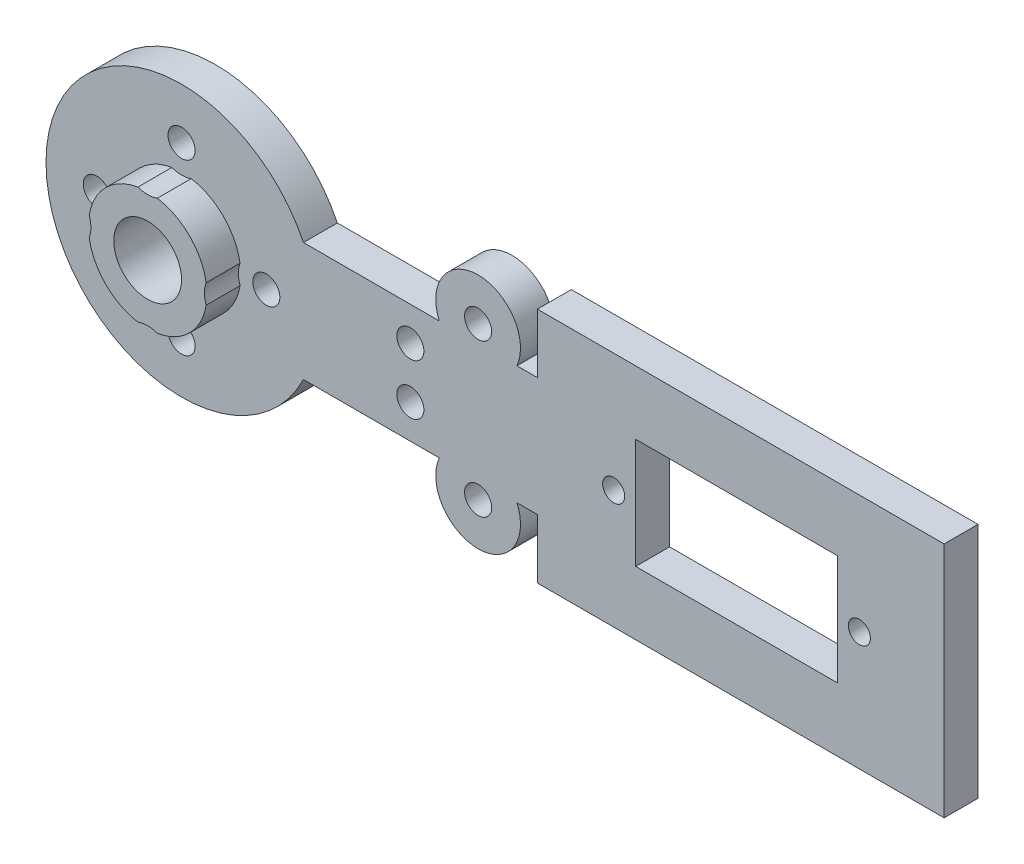
ISO-10303-21;
HEADER;
FILE_DESCRIPTION(('STEP AP214'),'2;1');
FILE_NAME('part.step','',(''),(''),'','','');
FILE_SCHEMA(('AUTOMOTIVE_DESIGN { 1 0 10303 214 1 1 1 1 }'));
ENDSEC;
DATA;
#1=APPLICATION_CONTEXT('core data for automotive mechanical design processes');
#2=APPLICATION_PROTOCOL_DEFINITION('international standard','automotive_design',2000,#1);
#3=PRODUCT_CONTEXT('',#1,'mechanical');
#4=PRODUCT('Part','Part','',(#3));
#5=PRODUCT_RELATED_PRODUCT_CATEGORY('part','',(#4));
#6=PRODUCT_DEFINITION_FORMATION('','',#4);
#7=PRODUCT_DEFINITION_CONTEXT('part definition',#1,'design');
#8=PRODUCT_DEFINITION('design','',#6,#7);
#9=PRODUCT_DEFINITION_SHAPE('','',#8);
#10=(LENGTH_UNIT() NAMED_UNIT(*) SI_UNIT(.MILLI.,.METRE.));
#11=(NAMED_UNIT(*) PLANE_ANGLE_UNIT() SI_UNIT($,.RADIAN.));
#12=(NAMED_UNIT(*) SI_UNIT($,.STERADIAN.) SOLID_ANGLE_UNIT());
#13=UNCERTAINTY_MEASURE_WITH_UNIT(LENGTH_MEASURE(1.E-05),#10,'distance_accuracy_value','');
#14=(GEOMETRIC_REPRESENTATION_CONTEXT(3) GLOBAL_UNCERTAINTY_ASSIGNED_CONTEXT((#13)) GLOBAL_UNIT_ASSIGNED_CONTEXT((#10,
#11,#12)) REPRESENTATION_CONTEXT('',''));
#15=CARTESIAN_POINT('',(0.,0.,0.));
#16=DIRECTION('',(0.,0.,1.));
#17=DIRECTION('',(1.,0.,0.));
#18=AXIS2_PLACEMENT_3D('',#15,#16,#17);
#19=CARTESIAN_POINT('',(0.,0.,8.));
#20=DIRECTION('',(0.,0.,1.));
#21=DIRECTION('',(1.,0.,0.));
#22=AXIS2_PLACEMENT_3D('',#19,#20,#21);
#23=PLANE('',#22);
#24=CARTESIAN_POINT('',(0.,0.,8.));
#25=DIRECTION('',(0.,0.,1.));
#26=DIRECTION('',(1.,0.,0.));
#27=AXIS2_PLACEMENT_3D('',#24,#25,#26);
#28=CIRCLE('',#27,4.);
#29=CARTESIAN_POINT('',(4.,0.,8.));
#30=VERTEX_POINT('',#29);
#31=EDGE_CURVE('E517',#30,#30,#28,.T.);
#32=ORIENTED_EDGE('',*,*,#31,.F.);
#33=EDGE_LOOP('',(#32));
#34=FACE_BOUND('',#33,.T.);
#35=CARTESIAN_POINT('',(10.,0.,8.));
#36=DIRECTION('',(0.,0.,1.));
#37=DIRECTION('',(1.,0.,0.));
#38=AXIS2_PLACEMENT_3D('',#35,#36,#37);
#39=CIRCLE('',#38,3.3);
#40=CARTESIAN_POINT('',(6.9055,1.14632881408433,8.));
#41=VERTEX_POINT('',#40);
#42=CARTESIAN_POINT('',(6.9055,-1.14632881408433,8.));
#43=VERTEX_POINT('',#42);
#44=EDGE_CURVE('E508',#41,#43,#39,.T.);
#45=ORIENTED_EDGE('',*,*,#44,.F.);
#46=CARTESIAN_POINT('',(0.,0.,8.));
#47=DIRECTION('',(0.,0.,1.));
#48=DIRECTION('',(1.,0.,0.));
#49=AXIS2_PLACEMENT_3D('',#46,#47,#48);
#50=CIRCLE('',#49,7.);
#51=CARTESIAN_POINT('',(1.14632881408434,6.9055,8.));
#52=VERTEX_POINT('',#51);
#53=EDGE_CURVE('E242',#41,#52,#50,.T.);
#54=ORIENTED_EDGE('',*,*,#53,.T.);
#55=CARTESIAN_POINT('',(0.,10.,8.));
#56=DIRECTION('',(0.,0.,1.));
#57=DIRECTION('',(1.,0.,0.));
#58=AXIS2_PLACEMENT_3D('',#55,#56,#57);
#59=CIRCLE('',#58,3.3);
#60=CARTESIAN_POINT('',(-1.14632881408434,6.9055,8.));
#61=VERTEX_POINT('',#60);
#62=EDGE_CURVE('E229',#61,#52,#59,.T.);
#63=ORIENTED_EDGE('',*,*,#62,.F.);
#64=CARTESIAN_POINT('',(-6.9055,1.14632881408434,8.));
#65=VERTEX_POINT('',#64);
#66=EDGE_CURVE('E521',#61,#65,#50,.T.);
#67=ORIENTED_EDGE('',*,*,#66,.T.);
#68=CARTESIAN_POINT('',(-10.,0.,8.));
#69=DIRECTION('',(0.,0.,1.));
#70=DIRECTION('',(1.,0.,0.));
#71=AXIS2_PLACEMENT_3D('',#68,#69,#70);
#72=CIRCLE('',#71,3.3);
#73=CARTESIAN_POINT('',(-6.9055,-1.14632881408434,8.));
#74=VERTEX_POINT('',#73);
#75=EDGE_CURVE('E545',#74,#65,#72,.T.);
#76=ORIENTED_EDGE('',*,*,#75,.F.);
#77=CARTESIAN_POINT('',(-1.14632881408434,-6.9055,8.));
#78=VERTEX_POINT('',#77);
#79=EDGE_CURVE('E528',#74,#78,#50,.T.);
#80=ORIENTED_EDGE('',*,*,#79,.T.);
#81=CARTESIAN_POINT('',(0.,-10.,8.));
#82=DIRECTION('',(0.,0.,1.));
#83=DIRECTION('',(1.,0.,0.));
#84=AXIS2_PLACEMENT_3D('',#81,#82,#83);
#85=CIRCLE('',#84,3.3);
#86=CARTESIAN_POINT('',(1.14632881408434,-6.9055,8.));
#87=VERTEX_POINT('',#86);
#88=EDGE_CURVE('E210',#87,#78,#85,.T.);
#89=ORIENTED_EDGE('',*,*,#88,.F.);
#90=EDGE_CURVE('E518',#87,#43,#50,.T.);
#91=ORIENTED_EDGE('',*,*,#90,.T.);
#92=EDGE_LOOP('',(#45,#54,#63,#67,#76,#80,#89,#91));
#93=FACE_BOUND('',#92,.T.);
#94=ADVANCED_FACE('F44',(#34,#93),#23,.T.);
#95=CARTESIAN_POINT('',(0.,0.,8.));
#96=DIRECTION('',(0.,0.,-1.));
#97=DIRECTION('',(-1.,0.,0.));
#98=AXIS2_PLACEMENT_3D('',#95,#96,#97);
#99=CYLINDRICAL_SURFACE('',#98,7.);
#100=DIRECTION('',(0.,0.,-1.));
#101=VECTOR('',#100,1.);
#102=CARTESIAN_POINT('',(6.9055,-1.14632881408434,6.));
#103=LINE('',#102,#101);
#104=CARTESIAN_POINT('',(6.9055,-1.14632881408433,4.));
#105=VERTEX_POINT('',#104);
#106=EDGE_CURVE('E11',#43,#105,#103,.T.);
#107=ORIENTED_EDGE('',*,*,#106,.F.);
#108=ORIENTED_EDGE('',*,*,#90,.F.);
#109=DIRECTION('',(0.,0.,-1.));
#110=VECTOR('',#109,1.);
#111=CARTESIAN_POINT('',(1.14632881408434,-6.9055,6.));
#112=LINE('',#111,#110);
#113=CARTESIAN_POINT('',(1.14632881408434,-6.9055,4.));
#114=VERTEX_POINT('',#113);
#115=EDGE_CURVE('E212',#114,#87,#112,.F.);
#116=ORIENTED_EDGE('',*,*,#115,.F.);
#117=CARTESIAN_POINT('',(0.,0.,4.));
#118=DIRECTION('',(0.,0.,1.));
#119=DIRECTION('',(1.,0.,0.));
#120=AXIS2_PLACEMENT_3D('',#117,#118,#119);
#121=CIRCLE('',#120,7.);
#122=EDGE_CURVE('E223',#114,#105,#121,.T.);
#123=ORIENTED_EDGE('',*,*,#122,.T.);
#124=EDGE_LOOP('',(#107,#108,#116,#123));
#125=FACE_BOUND('',#124,.T.);
#126=ADVANCED_FACE('F548',(#125),#99,.T.);
#127=DIRECTION('',(0.,0.,-1.));
#128=VECTOR('',#127,1.);
#129=CARTESIAN_POINT('',(6.9055,1.14632881408434,6.));
#130=LINE('',#129,#128);
#131=CARTESIAN_POINT('',(6.9055,1.14632881408433,4.));
#132=VERTEX_POINT('',#131);
#133=EDGE_CURVE('E53',#132,#41,#130,.F.);
#134=ORIENTED_EDGE('',*,*,#133,.F.);
#135=CARTESIAN_POINT('',(1.14632881408434,6.9055,4.));
#136=VERTEX_POINT('',#135);
#137=EDGE_CURVE('E240',#132,#136,#121,.T.);
#138=ORIENTED_EDGE('',*,*,#137,.T.);
#139=DIRECTION('',(0.,0.,-1.));
#140=VECTOR('',#139,1.);
#141=CARTESIAN_POINT('',(1.14632881408434,6.9055,6.));
#142=LINE('',#141,#140);
#143=EDGE_CURVE('E493',#52,#136,#142,.T.);
#144=ORIENTED_EDGE('',*,*,#143,.F.);
#145=ORIENTED_EDGE('',*,*,#53,.F.);
#146=EDGE_LOOP('',(#134,#138,#144,#145));
#147=FACE_BOUND('',#146,.T.);
#148=ADVANCED_FACE('F523',(#147),#99,.T.);
#149=DIRECTION('',(0.,0.,-1.));
#150=VECTOR('',#149,1.);
#151=CARTESIAN_POINT('',(-6.9055,1.14632881408434,6.));
#152=LINE('',#151,#150);
#153=CARTESIAN_POINT('',(-6.9055,1.14632881408434,4.));
#154=VERTEX_POINT('',#153);
#155=EDGE_CURVE('E496',#65,#154,#152,.T.);
#156=ORIENTED_EDGE('',*,*,#155,.F.);
#157=ORIENTED_EDGE('',*,*,#66,.F.);
#158=DIRECTION('',(0.,0.,-1.));
#159=VECTOR('',#158,1.);
#160=CARTESIAN_POINT('',(-1.14632881408434,6.9055,6.));
#161=LINE('',#160,#159);
#162=CARTESIAN_POINT('',(-1.14632881408434,6.9055,4.));
#163=VERTEX_POINT('',#162);
#164=EDGE_CURVE('E213',#163,#61,#161,.F.);
#165=ORIENTED_EDGE('',*,*,#164,.F.);
#166=EDGE_CURVE('E235',#163,#154,#121,.T.);
#167=ORIENTED_EDGE('',*,*,#166,.T.);
#168=EDGE_LOOP('',(#156,#157,#165,#167));
#169=FACE_BOUND('',#168,.T.);
#170=ADVANCED_FACE('F553',(#169),#99,.T.);
#171=DIRECTION('',(0.,0.,-1.));
#172=VECTOR('',#171,1.);
#173=CARTESIAN_POINT('',(-6.9055,-1.14632881408434,6.));
#174=LINE('',#173,#172);
#175=CARTESIAN_POINT('',(-6.9055,-1.14632881408434,4.));
#176=VERTEX_POINT('',#175);
#177=EDGE_CURVE('E226',#176,#74,#174,.F.);
#178=ORIENTED_EDGE('',*,*,#177,.F.);
#179=CARTESIAN_POINT('',(-1.14632881408434,-6.9055,4.));
#180=VERTEX_POINT('',#179);
#181=EDGE_CURVE('E225',#176,#180,#121,.T.);
#182=ORIENTED_EDGE('',*,*,#181,.T.);
#183=DIRECTION('',(0.,0.,-1.));
#184=VECTOR('',#183,1.);
#185=CARTESIAN_POINT('',(-1.14632881408434,-6.9055,6.));
#186=LINE('',#185,#184);
#187=EDGE_CURVE('E204',#78,#180,#186,.T.);
#188=ORIENTED_EDGE('',*,*,#187,.F.);
#189=ORIENTED_EDGE('',*,*,#79,.F.);
#190=EDGE_LOOP('',(#178,#182,#188,#189));
#191=FACE_BOUND('',#190,.T.);
#192=ADVANCED_FACE('F230',(#191),#99,.T.);
#193=CARTESIAN_POINT('',(0.,7.,4.));
#194=DIRECTION('',(0.,-1.,0.));
#195=DIRECTION('',(0.,0.,-1.));
#196=AXIS2_PLACEMENT_3D('',#193,#194,#195);
#197=PLANE('',#196);
#198=DIRECTION('',(0.,0.,-1.));
#199=VECTOR('',#198,1.);
#200=CARTESIAN_POINT('',(30.4174243050442,7.,4.));
#201=LINE('',#200,#199);
#202=CARTESIAN_POINT('',(30.4174243050442,7.,0.));
#203=VERTEX_POINT('',#202);
#204=CARTESIAN_POINT('',(30.4174243050442,7.,4.));
#205=VERTEX_POINT('',#204);
#206=EDGE_CURVE('E236',#203,#205,#201,.F.);
#207=ORIENTED_EDGE('',*,*,#206,.F.);
#208=DIRECTION('',(-1.,0.,0.));
#209=VECTOR('',#208,1.);
#210=CARTESIAN_POINT('',(0.,7.,0.));
#211=LINE('',#210,#209);
#212=CARTESIAN_POINT('',(14.3874945699382,7.,0.));
#213=VERTEX_POINT('',#212);
#214=EDGE_CURVE('E419',#203,#213,#211,.T.);
#215=ORIENTED_EDGE('',*,*,#214,.T.);
#216=DIRECTION('',(0.,0.,-1.));
#217=VECTOR('',#216,1.);
#218=CARTESIAN_POINT('',(14.3874945699382,7.,4.));
#219=LINE('',#218,#217);
#220=CARTESIAN_POINT('',(14.3874945699382,7.,4.));
#221=VERTEX_POINT('',#220);
#222=EDGE_CURVE('E395',#221,#213,#219,.T.);
#223=ORIENTED_EDGE('',*,*,#222,.F.);
#224=DIRECTION('',(-1.,0.,0.));
#225=VECTOR('',#224,1.);
#226=CARTESIAN_POINT('',(0.,7.,4.));
#227=LINE('',#226,#225);
#228=EDGE_CURVE('E406',#205,#221,#227,.T.);
#229=ORIENTED_EDGE('',*,*,#228,.F.);
#230=EDGE_LOOP('',(#207,#215,#223,#229));
#231=FACE_BOUND('',#230,.T.);
#232=ADVANCED_FACE('F673',(#231),#197,.F.);
#233=DIRECTION('',(0.,0.,-1.));
#234=VECTOR('',#233,1.);
#235=CARTESIAN_POINT('',(39.5825756949558,7.,4.));
#236=LINE('',#235,#234);
#237=CARTESIAN_POINT('',(39.5825756949558,7.,4.));
#238=VERTEX_POINT('',#237);
#239=CARTESIAN_POINT('',(39.5825756949558,7.,0.));
#240=VERTEX_POINT('',#239);
#241=EDGE_CURVE('E480',#238,#240,#236,.T.);
#242=ORIENTED_EDGE('',*,*,#241,.F.);
#243=CARTESIAN_POINT('',(42.,7.,4.));
#244=VERTEX_POINT('',#243);
#245=EDGE_CURVE('E415',#244,#238,#227,.T.);
#246=ORIENTED_EDGE('',*,*,#245,.F.);
#247=DIRECTION('',(0.,0.,1.));
#248=VECTOR('',#247,1.);
#249=CARTESIAN_POINT('',(42.,7.,4.));
#250=LINE('',#249,#248);
#251=CARTESIAN_POINT('',(42.,7.,0.));
#252=VERTEX_POINT('',#251);
#253=EDGE_CURVE('E381',#252,#244,#250,.T.);
#254=ORIENTED_EDGE('',*,*,#253,.F.);
#255=EDGE_CURVE('E423',#252,#240,#211,.T.);
#256=ORIENTED_EDGE('',*,*,#255,.T.);
#257=EDGE_LOOP('',(#242,#246,#254,#256));
#258=FACE_BOUND('',#257,.T.);
#259=ADVANCED_FACE('F671',(#258),#197,.F.);
#260=CARTESIAN_POINT('',(0.,-7.,4.));
#261=DIRECTION('',(0.,1.,0.));
#262=DIRECTION('',(0.,0.,1.));
#263=AXIS2_PLACEMENT_3D('',#260,#261,#262);
#264=PLANE('',#263);
#265=DIRECTION('',(0.,0.,-1.));
#266=VECTOR('',#265,1.);
#267=CARTESIAN_POINT('',(39.5825756949558,-7.,4.));
#268=LINE('',#267,#266);
#269=CARTESIAN_POINT('',(39.5825756949558,-7.,0.));
#270=VERTEX_POINT('',#269);
#271=CARTESIAN_POINT('',(39.5825756949558,-7.,4.));
#272=VERTEX_POINT('',#271);
#273=EDGE_CURVE('E471',#270,#272,#268,.F.);
#274=ORIENTED_EDGE('',*,*,#273,.F.);
#275=DIRECTION('',(1.,0.,0.));
#276=VECTOR('',#275,1.);
#277=CARTESIAN_POINT('',(0.,-7.,0.));
#278=LINE('',#277,#276);
#279=CARTESIAN_POINT('',(42.,-7.,0.));
#280=VERTEX_POINT('',#279);
#281=EDGE_CURVE('E403',#270,#280,#278,.T.);
#282=ORIENTED_EDGE('',*,*,#281,.T.);
#283=DIRECTION('',(0.,0.,-1.));
#284=VECTOR('',#283,1.);
#285=CARTESIAN_POINT('',(42.,-7.,4.));
#286=LINE('',#285,#284);
#287=CARTESIAN_POINT('',(42.,-7.,4.));
#288=VERTEX_POINT('',#287);
#289=EDGE_CURVE('E384',#288,#280,#286,.T.);
#290=ORIENTED_EDGE('',*,*,#289,.F.);
#291=DIRECTION('',(1.,0.,0.));
#292=VECTOR('',#291,1.);
#293=CARTESIAN_POINT('',(0.,-7.,4.));
#294=LINE('',#293,#292);
#295=EDGE_CURVE('E413',#272,#288,#294,.T.);
#296=ORIENTED_EDGE('',*,*,#295,.F.);
#297=EDGE_LOOP('',(#274,#282,#290,#296));
#298=FACE_BOUND('',#297,.T.);
#299=ADVANCED_FACE('F50',(#298),#264,.F.);
#300=DIRECTION('',(0.,0.,-1.));
#301=VECTOR('',#300,1.);
#302=CARTESIAN_POINT('',(30.4174243050442,-7.,4.));
#303=LINE('',#302,#301);
#304=CARTESIAN_POINT('',(30.4174243050442,-7.,4.));
#305=VERTEX_POINT('',#304);
#306=CARTESIAN_POINT('',(30.4174243050442,-7.,0.));
#307=VERTEX_POINT('',#306);
#308=EDGE_CURVE('E438',#305,#307,#303,.T.);
#309=ORIENTED_EDGE('',*,*,#308,.F.);
#310=CARTESIAN_POINT('',(14.3874945699382,-7.,4.));
#311=VERTEX_POINT('',#310);
#312=EDGE_CURVE('E408',#311,#305,#294,.T.);
#313=ORIENTED_EDGE('',*,*,#312,.F.);
#314=DIRECTION('',(0.,0.,-1.));
#315=VECTOR('',#314,1.);
#316=CARTESIAN_POINT('',(14.3874945699382,-7.,4.));
#317=LINE('',#316,#315);
#318=CARTESIAN_POINT('',(14.3874945699382,-7.,0.));
#319=VERTEX_POINT('',#318);
#320=EDGE_CURVE('E402',#319,#311,#317,.F.);
#321=ORIENTED_EDGE('',*,*,#320,.F.);
#322=EDGE_CURVE('E417',#319,#307,#278,.T.);
#323=ORIENTED_EDGE('',*,*,#322,.T.);
#324=EDGE_LOOP('',(#309,#313,#321,#323));
#325=FACE_BOUND('',#324,.T.);
#326=ADVANCED_FACE('F667',(#325),#264,.F.);
#327=CARTESIAN_POINT('',(0.,0.,4.));
#328=DIRECTION('',(0.,0.,-1.));
#329=DIRECTION('',(-1.,0.,0.));
#330=AXIS2_PLACEMENT_3D('',#327,#328,#329);
#331=PLANE('',#330);
#332=ORIENTED_EDGE('',*,*,#137,.F.);
#333=CARTESIAN_POINT('',(10.,0.,4.));
#334=DIRECTION('',(0.,0.,1.));
#335=DIRECTION('',(1.,0.,0.));
#336=AXIS2_PLACEMENT_3D('',#333,#334,#335);
#337=CIRCLE('',#336,3.3);
#338=EDGE_CURVE('E506',#132,#105,#337,.T.);
#339=ORIENTED_EDGE('',*,*,#338,.T.);
#340=ORIENTED_EDGE('',*,*,#122,.F.);
#341=CARTESIAN_POINT('',(0.,-10.,4.));
#342=DIRECTION('',(0.,0.,1.));
#343=DIRECTION('',(1.,0.,0.));
#344=AXIS2_PLACEMENT_3D('',#341,#342,#343);
#345=CIRCLE('',#344,3.3);
#346=EDGE_CURVE('E63',#114,#180,#345,.T.);
#347=ORIENTED_EDGE('',*,*,#346,.T.);
#348=ORIENTED_EDGE('',*,*,#181,.F.);
#349=CARTESIAN_POINT('',(-10.,0.,4.));
#350=DIRECTION('',(0.,0.,1.));
#351=DIRECTION('',(1.,0.,0.));
#352=AXIS2_PLACEMENT_3D('',#349,#350,#351);
#353=CIRCLE('',#352,3.3);
#354=EDGE_CURVE('E69',#176,#154,#353,.T.);
#355=ORIENTED_EDGE('',*,*,#354,.T.);
#356=ORIENTED_EDGE('',*,*,#166,.F.);
#357=CARTESIAN_POINT('',(0.,10.,4.));
#358=DIRECTION('',(0.,0.,1.));
#359=DIRECTION('',(1.,0.,0.));
#360=AXIS2_PLACEMENT_3D('',#357,#358,#359);
#361=CIRCLE('',#360,3.3);
#362=EDGE_CURVE('E538',#163,#136,#361,.T.);
#363=ORIENTED_EDGE('',*,*,#362,.T.);
#364=EDGE_LOOP('',(#332,#339,#340,#347,#348,#355,#356,#363));
#365=FACE_BOUND('',#364,.T.);
#366=CARTESIAN_POINT('',(35.,-9.,4.));
#367=DIRECTION('',(0.,0.,1.));
#368=DIRECTION('',(1.,0.,0.));
#369=AXIS2_PLACEMENT_3D('',#366,#367,#368);
#370=CIRCLE('',#369,1.6);
#371=CARTESIAN_POINT('',(36.6,-9.,4.));
#372=VERTEX_POINT('',#371);
#373=EDGE_CURVE('E241',#372,#372,#370,.T.);
#374=ORIENTED_EDGE('',*,*,#373,.F.);
#375=EDGE_LOOP('',(#374));
#376=FACE_BOUND('',#375,.T.);
#377=CARTESIAN_POINT('',(35.,9.,4.));
#378=DIRECTION('',(0.,0.,1.));
#379=DIRECTION('',(1.,0.,0.));
#380=AXIS2_PLACEMENT_3D('',#377,#378,#379);
#381=CIRCLE('',#380,1.6);
#382=CARTESIAN_POINT('',(36.6,9.,4.));
#383=VERTEX_POINT('',#382);
#384=EDGE_CURVE('E247',#383,#383,#381,.T.);
#385=ORIENTED_EDGE('',*,*,#384,.F.);
#386=EDGE_LOOP('',(#385));
#387=FACE_BOUND('',#386,.T.);
#388=ORIENTED_EDGE('',*,*,#245,.T.);
#389=CARTESIAN_POINT('',(35.,9.,4.));
#390=DIRECTION('',(0.,0.,1.));
#391=DIRECTION('',(1.,0.,0.));
#392=AXIS2_PLACEMENT_3D('',#389,#390,#391);
#393=CIRCLE('',#392,5.);
#394=EDGE_CURVE('E255',#238,#205,#393,.T.);
#395=ORIENTED_EDGE('',*,*,#394,.T.);
#396=ORIENTED_EDGE('',*,*,#228,.T.);
#397=CARTESIAN_POINT('',(0.,0.,4.));
#398=DIRECTION('',(0.,0.,1.));
#399=DIRECTION('',(1.,0.,0.));
#400=AXIS2_PLACEMENT_3D('',#397,#398,#399);
#401=CIRCLE('',#400,16.);
#402=EDGE_CURVE('E388',#221,#311,#401,.T.);
#403=ORIENTED_EDGE('',*,*,#402,.T.);
#404=ORIENTED_EDGE('',*,*,#312,.T.);
#405=CARTESIAN_POINT('',(35.,-9.,4.));
#406=DIRECTION('',(0.,0.,1.));
#407=DIRECTION('',(1.,0.,0.));
#408=AXIS2_PLACEMENT_3D('',#405,#406,#407);
#409=CIRCLE('',#408,5.);
#410=EDGE_CURVE('E262',#305,#272,#409,.T.);
#411=ORIENTED_EDGE('',*,*,#410,.T.);
#412=ORIENTED_EDGE('',*,*,#295,.T.);
#413=DIRECTION('',(0.,-1.,0.));
#414=VECTOR('',#413,1.);
#415=CARTESIAN_POINT('',(42.,-14.,4.));
#416=LINE('',#415,#414);
#417=CARTESIAN_POINT('',(42.,-14.,4.));
#418=VERTEX_POINT('',#417);
#419=EDGE_CURVE('E341',#288,#418,#416,.T.);
#420=ORIENTED_EDGE('',*,*,#419,.T.);
#421=DIRECTION('',(1.,0.,0.));
#422=VECTOR('',#421,1.);
#423=CARTESIAN_POINT('',(42.,-14.,4.));
#424=LINE('',#423,#422);
#425=CARTESIAN_POINT('',(90.,-14.,4.));
#426=VERTEX_POINT('',#425);
#427=EDGE_CURVE('E345',#418,#426,#424,.T.);
#428=ORIENTED_EDGE('',*,*,#427,.T.);
#429=DIRECTION('',(0.,1.,0.));
#430=VECTOR('',#429,1.);
#431=CARTESIAN_POINT('',(90.,-14.,4.));
#432=LINE('',#431,#430);
#433=CARTESIAN_POINT('',(90.,14.,4.));
#434=VERTEX_POINT('',#433);
#435=EDGE_CURVE('E347',#426,#434,#432,.T.);
#436=ORIENTED_EDGE('',*,*,#435,.T.);
#437=DIRECTION('',(-1.,0.,0.));
#438=VECTOR('',#437,1.);
#439=CARTESIAN_POINT('',(42.,14.,4.));
#440=LINE('',#439,#438);
#441=CARTESIAN_POINT('',(42.,14.,4.));
#442=VERTEX_POINT('',#441);
#443=EDGE_CURVE('E349',#434,#442,#440,.T.);
#444=ORIENTED_EDGE('',*,*,#443,.T.);
#445=EDGE_CURVE('E337',#442,#244,#416,.T.);
#446=ORIENTED_EDGE('',*,*,#445,.T.);
#447=EDGE_LOOP('',(#388,#395,#396,#403,#404,#411,#412,#420,#428,#436,#444,#446));
#448=FACE_BOUND('',#447,.T.);
#449=CARTESIAN_POINT('',(27.,-3.,4.));
#450=DIRECTION('',(0.,0.,1.));
#451=DIRECTION('',(1.,0.,0.));
#452=AXIS2_PLACEMENT_3D('',#449,#450,#451);
#453=CIRCLE('',#452,1.6);
#454=CARTESIAN_POINT('',(28.6,-3.,4.));
#455=VERTEX_POINT('',#454);
#456=EDGE_CURVE('E275',#455,#455,#453,.T.);
#457=ORIENTED_EDGE('',*,*,#456,.F.);
#458=EDGE_LOOP('',(#457));
#459=FACE_BOUND('',#458,.T.);
#460=CARTESIAN_POINT('',(27.,3.,4.));
#461=DIRECTION('',(0.,0.,1.));
#462=DIRECTION('',(1.,0.,0.));
#463=AXIS2_PLACEMENT_3D('',#460,#461,#462);
#464=CIRCLE('',#463,1.6);
#465=CARTESIAN_POINT('',(28.6,3.,4.));
#466=VERTEX_POINT('',#465);
#467=EDGE_CURVE('E268',#466,#466,#464,.T.);
#468=ORIENTED_EDGE('',*,*,#467,.F.);
#469=EDGE_LOOP('',(#468));
#470=FACE_BOUND('',#469,.T.);
#471=CARTESIAN_POINT('',(51.,0.,4.));
#472=DIRECTION('',(0.,0.,1.));
#473=DIRECTION('',(1.,0.,0.));
#474=AXIS2_PLACEMENT_3D('',#471,#472,#473);
#475=CIRCLE('',#474,1.3);
#476=CARTESIAN_POINT('',(52.3,0.,4.));
#477=VERTEX_POINT('',#476);
#478=EDGE_CURVE('E297',#477,#477,#475,.T.);
#479=ORIENTED_EDGE('',*,*,#478,.F.);
#480=EDGE_LOOP('',(#479));
#481=FACE_BOUND('',#480,.T.);
#482=CARTESIAN_POINT('',(80.,0.,4.));
#483=DIRECTION('',(0.,0.,1.));
#484=DIRECTION('',(1.,0.,0.));
#485=AXIS2_PLACEMENT_3D('',#482,#483,#484);
#486=CIRCLE('',#485,1.3);
#487=CARTESIAN_POINT('',(81.3,0.,4.));
#488=VERTEX_POINT('',#487);
#489=EDGE_CURVE('E301',#488,#488,#486,.T.);
#490=ORIENTED_EDGE('',*,*,#489,.F.);
#491=EDGE_LOOP('',(#490));
#492=FACE_BOUND('',#491,.T.);
#493=DIRECTION('',(0.,-1.,0.));
#494=VECTOR('',#493,1.);
#495=CARTESIAN_POINT('',(53.6,-6.5,4.));
#496=LINE('',#495,#494);
#497=CARTESIAN_POINT('',(53.6,6.5,4.));
#498=VERTEX_POINT('',#497);
#499=CARTESIAN_POINT('',(53.6,-6.5,4.));
#500=VERTEX_POINT('',#499);
#501=EDGE_CURVE('E306',#498,#500,#496,.T.);
#502=ORIENTED_EDGE('',*,*,#501,.F.);
#503=DIRECTION('',(-1.,0.,0.));
#504=VECTOR('',#503,1.);
#505=CARTESIAN_POINT('',(53.6,6.5,4.));
#506=LINE('',#505,#504);
#507=CARTESIAN_POINT('',(77.4,6.5,4.));
#508=VERTEX_POINT('',#507);
#509=EDGE_CURVE('E317',#508,#498,#506,.T.);
#510=ORIENTED_EDGE('',*,*,#509,.F.);
#511=DIRECTION('',(0.,1.,0.));
#512=VECTOR('',#511,1.);
#513=CARTESIAN_POINT('',(77.4,-6.5,4.));
#514=LINE('',#513,#512);
#515=CARTESIAN_POINT('',(77.4,-6.5,4.));
#516=VERTEX_POINT('',#515);
#517=EDGE_CURVE('E312',#516,#508,#514,.T.);
#518=ORIENTED_EDGE('',*,*,#517,.F.);
#519=DIRECTION('',(1.,0.,0.));
#520=VECTOR('',#519,1.);
#521=CARTESIAN_POINT('',(53.6,-6.5,4.));
#522=LINE('',#521,#520);
#523=EDGE_CURVE('E313',#500,#516,#522,.T.);
#524=ORIENTED_EDGE('',*,*,#523,.F.);
#525=EDGE_LOOP('',(#502,#510,#518,#524));
#526=FACE_BOUND('',#525,.T.);
#527=CARTESIAN_POINT('',(0.,-10.,4.));
#528=DIRECTION('',(0.,0.,1.));
#529=DIRECTION('',(1.,0.,0.));
#530=AXIS2_PLACEMENT_3D('',#527,#528,#529);
#531=CIRCLE('',#530,1.6);
#532=CARTESIAN_POINT('',(1.6,-10.,4.));
#533=VERTEX_POINT('',#532);
#534=EDGE_CURVE('E281',#533,#533,#531,.T.);
#535=ORIENTED_EDGE('',*,*,#534,.F.);
#536=EDGE_LOOP('',(#535));
#537=FACE_BOUND('',#536,.T.);
#538=CARTESIAN_POINT('',(0.,10.,4.));
#539=DIRECTION('',(0.,0.,1.));
#540=DIRECTION('',(1.,0.,0.));
#541=AXIS2_PLACEMENT_3D('',#538,#539,#540);
#542=CIRCLE('',#541,1.6);
#543=CARTESIAN_POINT('',(1.6,10.,4.));
#544=VERTEX_POINT('',#543);
#545=EDGE_CURVE('E278',#544,#544,#542,.T.);
#546=ORIENTED_EDGE('',*,*,#545,.F.);
#547=EDGE_LOOP('',(#546));
#548=FACE_BOUND('',#547,.T.);
#549=CARTESIAN_POINT('',(-10.,0.,4.));
#550=DIRECTION('',(0.,0.,1.));
#551=DIRECTION('',(1.,0.,0.));
#552=AXIS2_PLACEMENT_3D('',#549,#550,#551);
#553=CIRCLE('',#552,1.6);
#554=CARTESIAN_POINT('',(-8.4,0.,4.));
#555=VERTEX_POINT('',#554);
#556=EDGE_CURVE('E291',#555,#555,#553,.T.);
#557=ORIENTED_EDGE('',*,*,#556,.F.);
#558=EDGE_LOOP('',(#557));
#559=FACE_BOUND('',#558,.T.);
#560=CARTESIAN_POINT('',(10.,0.,4.));
#561=DIRECTION('',(0.,0.,1.));
#562=DIRECTION('',(1.,0.,0.));
#563=AXIS2_PLACEMENT_3D('',#560,#561,#562);
#564=CIRCLE('',#563,1.6);
#565=CARTESIAN_POINT('',(11.6,0.,4.));
#566=VERTEX_POINT('',#565);
#567=EDGE_CURVE('E289',#566,#566,#564,.T.);
#568=ORIENTED_EDGE('',*,*,#567,.F.);
#569=EDGE_LOOP('',(#568));
#570=FACE_BOUND('',#569,.T.);
#571=ADVANCED_FACE('F219',(#365,#376,#387,#448,#459,#470,#481,#492,#526,#537,#548,#559,#570),
#331,.F.);
#572=CARTESIAN_POINT('',(0.,0.,0.));
#573=DIRECTION('',(0.,0.,-1.));
#574=DIRECTION('',(-1.,0.,0.));
#575=AXIS2_PLACEMENT_3D('',#572,#573,#574);
#576=PLANE('',#575);
#577=CARTESIAN_POINT('',(35.,-9.,0.));
#578=DIRECTION('',(0.,0.,-1.));
#579=DIRECTION('',(-1.,0.,0.));
#580=AXIS2_PLACEMENT_3D('',#577,#578,#579);
#581=CIRCLE('',#580,1.6);
#582=CARTESIAN_POINT('',(33.4,-9.,0.));
#583=VERTEX_POINT('',#582);
#584=EDGE_CURVE('E263',#583,#583,#581,.F.);
#585=ORIENTED_EDGE('',*,*,#584,.T.);
#586=EDGE_LOOP('',(#585));
#587=FACE_BOUND('',#586,.T.);
#588=CARTESIAN_POINT('',(35.,9.,0.));
#589=DIRECTION('',(0.,0.,-1.));
#590=DIRECTION('',(-1.,0.,0.));
#591=AXIS2_PLACEMENT_3D('',#588,#589,#590);
#592=CIRCLE('',#591,1.6);
#593=CARTESIAN_POINT('',(33.4,9.,0.));
#594=VERTEX_POINT('',#593);
#595=EDGE_CURVE('E249',#594,#594,#592,.F.);
#596=ORIENTED_EDGE('',*,*,#595,.T.);
#597=EDGE_LOOP('',(#596));
#598=FACE_BOUND('',#597,.T.);
#599=CARTESIAN_POINT('',(27.,-3.,0.));
#600=DIRECTION('',(0.,0.,-1.));
#601=DIRECTION('',(-1.,0.,0.));
#602=AXIS2_PLACEMENT_3D('',#599,#600,#601);
#603=CIRCLE('',#602,1.6);
#604=CARTESIAN_POINT('',(25.4,-3.,0.));
#605=VERTEX_POINT('',#604);
#606=EDGE_CURVE('E299',#605,#605,#603,.F.);
#607=ORIENTED_EDGE('',*,*,#606,.T.);
#608=EDGE_LOOP('',(#607));
#609=FACE_BOUND('',#608,.T.);
#610=CARTESIAN_POINT('',(27.,3.,0.));
#611=DIRECTION('',(0.,0.,-1.));
#612=DIRECTION('',(-1.,0.,0.));
#613=AXIS2_PLACEMENT_3D('',#610,#611,#612);
#614=CIRCLE('',#613,1.6);
#615=CARTESIAN_POINT('',(25.4,3.,0.));
#616=VERTEX_POINT('',#615);
#617=EDGE_CURVE('E277',#616,#616,#614,.F.);
#618=ORIENTED_EDGE('',*,*,#617,.T.);
#619=EDGE_LOOP('',(#618));
#620=FACE_BOUND('',#619,.T.);
#621=CARTESIAN_POINT('',(0.,10.,0.));
#622=DIRECTION('',(0.,0.,-1.));
#623=DIRECTION('',(-1.,0.,0.));
#624=AXIS2_PLACEMENT_3D('',#621,#622,#623);
#625=CIRCLE('',#624,1.6);
#626=CARTESIAN_POINT('',(-1.6,10.,0.));
#627=VERTEX_POINT('',#626);
#628=EDGE_CURVE('E450',#627,#627,#625,.F.);
#629=ORIENTED_EDGE('',*,*,#628,.T.);
#630=EDGE_LOOP('',(#629));
#631=FACE_BOUND('',#630,.T.);
#632=CARTESIAN_POINT('',(0.,-10.,0.));
#633=DIRECTION('',(0.,0.,-1.));
#634=DIRECTION('',(-1.,0.,0.));
#635=AXIS2_PLACEMENT_3D('',#632,#633,#634);
#636=CIRCLE('',#635,1.6);
#637=CARTESIAN_POINT('',(-1.6,-10.,0.));
#638=VERTEX_POINT('',#637);
#639=EDGE_CURVE('E460',#638,#638,#636,.F.);
#640=ORIENTED_EDGE('',*,*,#639,.T.);
#641=EDGE_LOOP('',(#640));
#642=FACE_BOUND('',#641,.T.);
#643=CARTESIAN_POINT('',(10.,0.,0.));
#644=DIRECTION('',(0.,0.,-1.));
#645=DIRECTION('',(-1.,0.,0.));
#646=AXIS2_PLACEMENT_3D('',#643,#644,#645);
#647=CIRCLE('',#646,1.6);
#648=CARTESIAN_POINT('',(8.4,0.,0.));
#649=VERTEX_POINT('',#648);
#650=EDGE_CURVE('E451',#649,#649,#647,.F.);
#651=ORIENTED_EDGE('',*,*,#650,.T.);
#652=EDGE_LOOP('',(#651));
#653=FACE_BOUND('',#652,.T.);
#654=CARTESIAN_POINT('',(-10.,0.,0.));
#655=DIRECTION('',(0.,0.,-1.));
#656=DIRECTION('',(-1.,0.,0.));
#657=AXIS2_PLACEMENT_3D('',#654,#655,#656);
#658=CIRCLE('',#657,1.6);
#659=CARTESIAN_POINT('',(-11.6,0.,0.));
#660=VERTEX_POINT('',#659);
#661=EDGE_CURVE('E285',#660,#660,#658,.F.);
#662=ORIENTED_EDGE('',*,*,#661,.T.);
#663=EDGE_LOOP('',(#662));
#664=FACE_BOUND('',#663,.T.);
#665=CARTESIAN_POINT('',(0.,0.,0.));
#666=DIRECTION('',(0.,0.,-1.));
#667=DIRECTION('',(-1.,0.,0.));
#668=AXIS2_PLACEMENT_3D('',#665,#666,#667);
#669=CIRCLE('',#668,4.);
#670=CARTESIAN_POINT('',(-4.,0.,0.));
#671=VERTEX_POINT('',#670);
#672=EDGE_CURVE('E307',#671,#671,#669,.F.);
#673=ORIENTED_EDGE('',*,*,#672,.T.);
#674=EDGE_LOOP('',(#673));
#675=FACE_BOUND('',#674,.T.);
#676=CARTESIAN_POINT('',(51.,0.,0.));
#677=DIRECTION('',(0.,0.,-1.));
#678=DIRECTION('',(-1.,0.,0.));
#679=AXIS2_PLACEMENT_3D('',#676,#677,#678);
#680=CIRCLE('',#679,1.3);
#681=CARTESIAN_POINT('',(49.7,0.,0.));
#682=VERTEX_POINT('',#681);
#683=EDGE_CURVE('E315',#682,#682,#680,.F.);
#684=ORIENTED_EDGE('',*,*,#683,.T.);
#685=EDGE_LOOP('',(#684));
#686=FACE_BOUND('',#685,.T.);
#687=CARTESIAN_POINT('',(80.,0.,0.));
#688=DIRECTION('',(0.,0.,-1.));
#689=DIRECTION('',(-1.,0.,0.));
#690=AXIS2_PLACEMENT_3D('',#687,#688,#689);
#691=CIRCLE('',#690,1.3);
#692=CARTESIAN_POINT('',(78.7,0.,0.));
#693=VERTEX_POINT('',#692);
#694=EDGE_CURVE('E305',#693,#693,#691,.F.);
#695=ORIENTED_EDGE('',*,*,#694,.T.);
#696=EDGE_LOOP('',(#695));
#697=FACE_BOUND('',#696,.T.);
#698=ORIENTED_EDGE('',*,*,#214,.F.);
#699=CARTESIAN_POINT('',(35.,9.,0.));
#700=DIRECTION('',(0.,0.,1.));
#701=DIRECTION('',(1.,0.,0.));
#702=AXIS2_PLACEMENT_3D('',#699,#700,#701);
#703=CIRCLE('',#702,5.);
#704=EDGE_CURVE('E259',#240,#203,#703,.T.);
#705=ORIENTED_EDGE('',*,*,#704,.F.);
#706=ORIENTED_EDGE('',*,*,#255,.F.);
#707=DIRECTION('',(0.,-1.,0.));
#708=VECTOR('',#707,1.);
#709=CARTESIAN_POINT('',(42.,-14.,0.));
#710=LINE('',#709,#708);
#711=CARTESIAN_POINT('',(42.,14.,0.));
#712=VERTEX_POINT('',#711);
#713=EDGE_CURVE('E352',#712,#252,#710,.T.);
#714=ORIENTED_EDGE('',*,*,#713,.F.);
#715=DIRECTION('',(-1.,0.,0.));
#716=VECTOR('',#715,1.);
#717=CARTESIAN_POINT('',(42.,14.,0.));
#718=LINE('',#717,#716);
#719=CARTESIAN_POINT('',(90.,14.,0.));
#720=VERTEX_POINT('',#719);
#721=EDGE_CURVE('E361',#720,#712,#718,.T.);
#722=ORIENTED_EDGE('',*,*,#721,.F.);
#723=DIRECTION('',(0.,1.,0.));
#724=VECTOR('',#723,1.);
#725=CARTESIAN_POINT('',(90.,-14.,0.));
#726=LINE('',#725,#724);
#727=CARTESIAN_POINT('',(90.,-14.,0.));
#728=VERTEX_POINT('',#727);
#729=EDGE_CURVE('E357',#728,#720,#726,.T.);
#730=ORIENTED_EDGE('',*,*,#729,.F.);
#731=DIRECTION('',(1.,0.,0.));
#732=VECTOR('',#731,1.);
#733=CARTESIAN_POINT('',(42.,-14.,0.));
#734=LINE('',#733,#732);
#735=CARTESIAN_POINT('',(42.,-14.,0.));
#736=VERTEX_POINT('',#735);
#737=EDGE_CURVE('E360',#736,#728,#734,.T.);
#738=ORIENTED_EDGE('',*,*,#737,.F.);
#739=EDGE_CURVE('E339',#280,#736,#710,.T.);
#740=ORIENTED_EDGE('',*,*,#739,.F.);
#741=ORIENTED_EDGE('',*,*,#281,.F.);
#742=CARTESIAN_POINT('',(35.,-9.,0.));
#743=DIRECTION('',(0.,0.,1.));
#744=DIRECTION('',(1.,0.,0.));
#745=AXIS2_PLACEMENT_3D('',#742,#743,#744);
#746=CIRCLE('',#745,5.);
#747=EDGE_CURVE('E256',#307,#270,#746,.T.);
#748=ORIENTED_EDGE('',*,*,#747,.F.);
#749=ORIENTED_EDGE('',*,*,#322,.F.);
#750=CARTESIAN_POINT('',(0.,0.,0.));
#751=DIRECTION('',(0.,0.,1.));
#752=DIRECTION('',(1.,0.,0.));
#753=AXIS2_PLACEMENT_3D('',#750,#751,#752);
#754=CIRCLE('',#753,16.);
#755=EDGE_CURVE('E386',#213,#319,#754,.T.);
#756=ORIENTED_EDGE('',*,*,#755,.F.);
#757=EDGE_LOOP('',(#698,#705,#706,#714,#722,#730,#738,#740,#741,#748,#749,#756));
#758=FACE_BOUND('',#757,.T.);
#759=DIRECTION('',(-1.,0.,0.));
#760=VECTOR('',#759,1.);
#761=CARTESIAN_POINT('',(0.,6.5,0.));
#762=LINE('',#761,#760);
#763=CARTESIAN_POINT('',(77.4,6.5,0.));
#764=VERTEX_POINT('',#763);
#765=CARTESIAN_POINT('',(53.6,6.5,0.));
#766=VERTEX_POINT('',#765);
#767=EDGE_CURVE('E418',#764,#766,#762,.T.);
#768=ORIENTED_EDGE('',*,*,#767,.T.);
#769=DIRECTION('',(0.,-1.,0.));
#770=VECTOR('',#769,1.);
#771=CARTESIAN_POINT('',(53.6,0.,0.));
#772=LINE('',#771,#770);
#773=CARTESIAN_POINT('',(53.6,-6.5,0.));
#774=VERTEX_POINT('',#773);
#775=EDGE_CURVE('E434',#766,#774,#772,.T.);
#776=ORIENTED_EDGE('',*,*,#775,.T.);
#777=DIRECTION('',(1.,0.,0.));
#778=VECTOR('',#777,1.);
#779=CARTESIAN_POINT('',(0.,-6.5,0.));
#780=LINE('',#779,#778);
#781=CARTESIAN_POINT('',(77.4,-6.5,0.));
#782=VERTEX_POINT('',#781);
#783=EDGE_CURVE('E431',#774,#782,#780,.T.);
#784=ORIENTED_EDGE('',*,*,#783,.T.);
#785=DIRECTION('',(0.,1.,0.));
#786=VECTOR('',#785,1.);
#787=CARTESIAN_POINT('',(77.4,0.,0.));
#788=LINE('',#787,#786);
#789=EDGE_CURVE('E430',#782,#764,#788,.T.);
#790=ORIENTED_EDGE('',*,*,#789,.T.);
#791=EDGE_LOOP('',(#768,#776,#784,#790));
#792=FACE_BOUND('',#791,.T.);
#793=ADVANCED_FACE('F661',(#587,#598,#609,#620,#631,#642,#653,#664,#675,#686,#697,#758,#792),
#576,.T.);
#794=CARTESIAN_POINT('',(0.,0.,4.));
#795=DIRECTION('',(0.,0.,-1.));
#796=DIRECTION('',(-1.,0.,0.));
#797=AXIS2_PLACEMENT_3D('',#794,#795,#796);
#798=CYLINDRICAL_SURFACE('',#797,16.);
#799=ORIENTED_EDGE('',*,*,#755,.T.);
#800=ORIENTED_EDGE('',*,*,#320,.T.);
#801=ORIENTED_EDGE('',*,*,#402,.F.);
#802=ORIENTED_EDGE('',*,*,#222,.T.);
#803=EDGE_LOOP('',(#799,#800,#801,#802));
#804=FACE_BOUND('',#803,.T.);
#805=ADVANCED_FACE('F659',(#804),#798,.T.);
#806=CARTESIAN_POINT('',(42.,-14.,4.));
#807=DIRECTION('',(1.,0.,0.));
#808=DIRECTION('',(0.,0.,-1.));
#809=AXIS2_PLACEMENT_3D('',#806,#807,#808);
#810=PLANE('',#809);
#811=ORIENTED_EDGE('',*,*,#419,.F.);
#812=ORIENTED_EDGE('',*,*,#289,.T.);
#813=ORIENTED_EDGE('',*,*,#739,.T.);
#814=DIRECTION('',(0.,0.,-1.));
#815=VECTOR('',#814,1.);
#816=CARTESIAN_POINT('',(42.,-14.,4.));
#817=LINE('',#816,#815);
#818=EDGE_CURVE('E380',#418,#736,#817,.T.);
#819=ORIENTED_EDGE('',*,*,#818,.F.);
#820=EDGE_LOOP('',(#811,#812,#813,#819));
#821=FACE_BOUND('',#820,.T.);
#822=ADVANCED_FACE('F660',(#821),#810,.F.);
#823=ORIENTED_EDGE('',*,*,#713,.T.);
#824=ORIENTED_EDGE('',*,*,#253,.T.);
#825=ORIENTED_EDGE('',*,*,#445,.F.);
#826=DIRECTION('',(0.,0.,-1.));
#827=VECTOR('',#826,1.);
#828=CARTESIAN_POINT('',(42.,14.,4.));
#829=LINE('',#828,#827);
#830=EDGE_CURVE('E354',#442,#712,#829,.T.);
#831=ORIENTED_EDGE('',*,*,#830,.T.);
#832=EDGE_LOOP('',(#823,#824,#825,#831));
#833=FACE_BOUND('',#832,.T.);
#834=ADVANCED_FACE('F654',(#833),#810,.F.);
#835=CARTESIAN_POINT('',(42.,-14.,4.));
#836=DIRECTION('',(0.,1.,0.));
#837=DIRECTION('',(0.,0.,1.));
#838=AXIS2_PLACEMENT_3D('',#835,#836,#837);
#839=PLANE('',#838);
#840=ORIENTED_EDGE('',*,*,#737,.T.);
#841=DIRECTION('',(0.,0.,-1.));
#842=VECTOR('',#841,1.);
#843=CARTESIAN_POINT('',(90.,-14.,4.));
#844=LINE('',#843,#842);
#845=EDGE_CURVE('E373',#426,#728,#844,.T.);
#846=ORIENTED_EDGE('',*,*,#845,.F.);
#847=ORIENTED_EDGE('',*,*,#427,.F.);
#848=ORIENTED_EDGE('',*,*,#818,.T.);
#849=EDGE_LOOP('',(#840,#846,#847,#848));
#850=FACE_BOUND('',#849,.T.);
#851=ADVANCED_FACE('F651',(#850),#839,.F.);
#852=CARTESIAN_POINT('',(90.,-14.,4.));
#853=DIRECTION('',(-1.,0.,0.));
#854=DIRECTION('',(0.,0.,1.));
#855=AXIS2_PLACEMENT_3D('',#852,#853,#854);
#856=PLANE('',#855);
#857=ORIENTED_EDGE('',*,*,#729,.T.);
#858=DIRECTION('',(0.,0.,-1.));
#859=VECTOR('',#858,1.);
#860=CARTESIAN_POINT('',(90.,14.,4.));
#861=LINE('',#860,#859);
#862=EDGE_CURVE('E369',#434,#720,#861,.T.);
#863=ORIENTED_EDGE('',*,*,#862,.F.);
#864=ORIENTED_EDGE('',*,*,#435,.F.);
#865=ORIENTED_EDGE('',*,*,#845,.T.);
#866=EDGE_LOOP('',(#857,#863,#864,#865));
#867=FACE_BOUND('',#866,.T.);
#868=ADVANCED_FACE('F650',(#867),#856,.F.);
#869=CARTESIAN_POINT('',(42.,14.,4.));
#870=DIRECTION('',(0.,-1.,0.));
#871=DIRECTION('',(0.,0.,-1.));
#872=AXIS2_PLACEMENT_3D('',#869,#870,#871);
#873=PLANE('',#872);
#874=ORIENTED_EDGE('',*,*,#721,.T.);
#875=ORIENTED_EDGE('',*,*,#830,.F.);
#876=ORIENTED_EDGE('',*,*,#443,.F.);
#877=ORIENTED_EDGE('',*,*,#862,.T.);
#878=EDGE_LOOP('',(#874,#875,#876,#877));
#879=FACE_BOUND('',#878,.T.);
#880=ADVANCED_FACE('F641',(#879),#873,.F.);
#881=CARTESIAN_POINT('',(53.6,-6.5,4.));
#882=DIRECTION('',(1.,0.,0.));
#883=DIRECTION('',(0.,0.,-1.));
#884=AXIS2_PLACEMENT_3D('',#881,#882,#883);
#885=PLANE('',#884);
#886=DIRECTION('',(0.,0.,-1.));
#887=VECTOR('',#886,1.);
#888=CARTESIAN_POINT('',(53.6,6.5,4.));
#889=LINE('',#888,#887);
#890=EDGE_CURVE('E325',#498,#766,#889,.T.);
#891=ORIENTED_EDGE('',*,*,#890,.F.);
#892=ORIENTED_EDGE('',*,*,#501,.T.);
#893=DIRECTION('',(0.,0.,-1.));
#894=VECTOR('',#893,1.);
#895=CARTESIAN_POINT('',(53.6,-6.5,4.));
#896=LINE('',#895,#894);
#897=EDGE_CURVE('E334',#500,#774,#896,.T.);
#898=ORIENTED_EDGE('',*,*,#897,.T.);
#899=ORIENTED_EDGE('',*,*,#775,.F.);
#900=EDGE_LOOP('',(#891,#892,#898,#899));
#901=FACE_BOUND('',#900,.T.);
#902=ADVANCED_FACE('F640',(#901),#885,.T.);
#903=CARTESIAN_POINT('',(53.6,-6.5,4.));
#904=DIRECTION('',(0.,1.,0.));
#905=DIRECTION('',(0.,0.,1.));
#906=AXIS2_PLACEMENT_3D('',#903,#904,#905);
#907=PLANE('',#906);
#908=ORIENTED_EDGE('',*,*,#897,.F.);
#909=ORIENTED_EDGE('',*,*,#523,.T.);
#910=DIRECTION('',(0.,0.,-1.));
#911=VECTOR('',#910,1.);
#912=CARTESIAN_POINT('',(77.4,-6.5,4.));
#913=LINE('',#912,#911);
#914=EDGE_CURVE('E328',#516,#782,#913,.T.);
#915=ORIENTED_EDGE('',*,*,#914,.T.);
#916=ORIENTED_EDGE('',*,*,#783,.F.);
#917=EDGE_LOOP('',(#908,#909,#915,#916));
#918=FACE_BOUND('',#917,.T.);
#919=ADVANCED_FACE('F632',(#918),#907,.T.);
#920=CARTESIAN_POINT('',(77.4,-6.5,4.));
#921=DIRECTION('',(-1.,0.,0.));
#922=DIRECTION('',(0.,0.,1.));
#923=AXIS2_PLACEMENT_3D('',#920,#921,#922);
#924=PLANE('',#923);
#925=ORIENTED_EDGE('',*,*,#914,.F.);
#926=ORIENTED_EDGE('',*,*,#517,.T.);
#927=DIRECTION('',(0.,0.,-1.));
#928=VECTOR('',#927,1.);
#929=CARTESIAN_POINT('',(77.4,6.5,4.));
#930=LINE('',#929,#928);
#931=EDGE_CURVE('E324',#508,#764,#930,.T.);
#932=ORIENTED_EDGE('',*,*,#931,.T.);
#933=ORIENTED_EDGE('',*,*,#789,.F.);
#934=EDGE_LOOP('',(#925,#926,#932,#933));
#935=FACE_BOUND('',#934,.T.);
#936=ADVANCED_FACE('F633',(#935),#924,.T.);
#937=CARTESIAN_POINT('',(53.6,6.5,4.));
#938=DIRECTION('',(0.,-1.,0.));
#939=DIRECTION('',(0.,0.,-1.));
#940=AXIS2_PLACEMENT_3D('',#937,#938,#939);
#941=PLANE('',#940);
#942=ORIENTED_EDGE('',*,*,#931,.F.);
#943=ORIENTED_EDGE('',*,*,#509,.T.);
#944=ORIENTED_EDGE('',*,*,#890,.T.);
#945=ORIENTED_EDGE('',*,*,#767,.F.);
#946=EDGE_LOOP('',(#942,#943,#944,#945));
#947=FACE_BOUND('',#946,.T.);
#948=ADVANCED_FACE('F629',(#947),#941,.T.);
#949=CARTESIAN_POINT('',(80.,0.,4.));
#950=DIRECTION('',(0.,0.,-1.));
#951=DIRECTION('',(-1.,0.,0.));
#952=AXIS2_PLACEMENT_3D('',#949,#950,#951);
#953=CYLINDRICAL_SURFACE('',#952,1.3);
#954=ORIENTED_EDGE('',*,*,#694,.F.);
#955=EDGE_LOOP('',(#954));
#956=FACE_BOUND('',#955,.T.);
#957=ORIENTED_EDGE('',*,*,#489,.T.);
#958=EDGE_LOOP('',(#957));
#959=FACE_BOUND('',#958,.T.);
#960=ADVANCED_FACE('F621',(#956,#959),#953,.F.);
#961=CARTESIAN_POINT('',(51.,0.,4.));
#962=DIRECTION('',(0.,0.,-1.));
#963=DIRECTION('',(-1.,0.,0.));
#964=AXIS2_PLACEMENT_3D('',#961,#962,#963);
#965=CYLINDRICAL_SURFACE('',#964,1.3);
#966=ORIENTED_EDGE('',*,*,#683,.F.);
#967=EDGE_LOOP('',(#966));
#968=FACE_BOUND('',#967,.T.);
#969=ORIENTED_EDGE('',*,*,#478,.T.);
#970=EDGE_LOOP('',(#969));
#971=FACE_BOUND('',#970,.T.);
#972=ADVANCED_FACE('F619',(#968,#971),#965,.F.);
#973=CARTESIAN_POINT('',(0.,0.,4.));
#974=DIRECTION('',(0.,0.,-1.));
#975=DIRECTION('',(-1.,0.,0.));
#976=AXIS2_PLACEMENT_3D('',#973,#974,#975);
#977=CYLINDRICAL_SURFACE('',#976,4.);
#978=ORIENTED_EDGE('',*,*,#672,.F.);
#979=EDGE_LOOP('',(#978));
#980=FACE_BOUND('',#979,.T.);
#981=ORIENTED_EDGE('',*,*,#31,.T.);
#982=EDGE_LOOP('',(#981));
#983=FACE_BOUND('',#982,.T.);
#984=ADVANCED_FACE('F618',(#980,#983),#977,.F.);
#985=CARTESIAN_POINT('',(-10.,0.,4.));
#986=DIRECTION('',(0.,0.,-1.));
#987=DIRECTION('',(-1.,0.,0.));
#988=AXIS2_PLACEMENT_3D('',#985,#986,#987);
#989=CYLINDRICAL_SURFACE('',#988,1.6);
#990=ORIENTED_EDGE('',*,*,#661,.F.);
#991=EDGE_LOOP('',(#990));
#992=FACE_BOUND('',#991,.T.);
#993=ORIENTED_EDGE('',*,*,#556,.T.);
#994=EDGE_LOOP('',(#993));
#995=FACE_BOUND('',#994,.T.);
#996=ADVANCED_FACE('F614',(#992,#995),#989,.F.);
#997=CARTESIAN_POINT('',(10.,0.,4.));
#998=DIRECTION('',(0.,0.,-1.));
#999=DIRECTION('',(-1.,0.,0.));
#1000=AXIS2_PLACEMENT_3D('',#997,#998,#999);
#1001=CYLINDRICAL_SURFACE('',#1000,1.6);
#1002=ORIENTED_EDGE('',*,*,#650,.F.);
#1003=EDGE_LOOP('',(#1002));
#1004=FACE_BOUND('',#1003,.T.);
#1005=ORIENTED_EDGE('',*,*,#567,.T.);
#1006=EDGE_LOOP('',(#1005));
#1007=FACE_BOUND('',#1006,.T.);
#1008=ADVANCED_FACE('F609',(#1004,#1007),#1001,.F.);
#1009=CARTESIAN_POINT('',(0.,-10.,4.));
#1010=DIRECTION('',(0.,0.,-1.));
#1011=DIRECTION('',(-1.,0.,0.));
#1012=AXIS2_PLACEMENT_3D('',#1009,#1010,#1011);
#1013=CYLINDRICAL_SURFACE('',#1012,1.6);
#1014=ORIENTED_EDGE('',*,*,#639,.F.);
#1015=EDGE_LOOP('',(#1014));
#1016=FACE_BOUND('',#1015,.T.);
#1017=ORIENTED_EDGE('',*,*,#534,.T.);
#1018=EDGE_LOOP('',(#1017));
#1019=FACE_BOUND('',#1018,.T.);
#1020=ADVANCED_FACE('F603',(#1016,#1019),#1013,.F.);
#1021=CARTESIAN_POINT('',(0.,10.,4.));
#1022=DIRECTION('',(0.,0.,-1.));
#1023=DIRECTION('',(-1.,0.,0.));
#1024=AXIS2_PLACEMENT_3D('',#1021,#1022,#1023);
#1025=CYLINDRICAL_SURFACE('',#1024,1.6);
#1026=ORIENTED_EDGE('',*,*,#628,.F.);
#1027=EDGE_LOOP('',(#1026));
#1028=FACE_BOUND('',#1027,.T.);
#1029=ORIENTED_EDGE('',*,*,#545,.T.);
#1030=EDGE_LOOP('',(#1029));
#1031=FACE_BOUND('',#1030,.T.);
#1032=ADVANCED_FACE('F599',(#1028,#1031),#1025,.F.);
#1033=CARTESIAN_POINT('',(27.,3.,4.));
#1034=DIRECTION('',(0.,0.,-1.));
#1035=DIRECTION('',(-1.,0.,0.));
#1036=AXIS2_PLACEMENT_3D('',#1033,#1034,#1035);
#1037=CYLINDRICAL_SURFACE('',#1036,1.6);
#1038=ORIENTED_EDGE('',*,*,#617,.F.);
#1039=EDGE_LOOP('',(#1038));
#1040=FACE_BOUND('',#1039,.T.);
#1041=ORIENTED_EDGE('',*,*,#467,.T.);
#1042=EDGE_LOOP('',(#1041));
#1043=FACE_BOUND('',#1042,.T.);
#1044=ADVANCED_FACE('F596',(#1040,#1043),#1037,.F.);
#1045=CARTESIAN_POINT('',(27.,-3.,4.));
#1046=DIRECTION('',(0.,0.,-1.));
#1047=DIRECTION('',(-1.,0.,0.));
#1048=AXIS2_PLACEMENT_3D('',#1045,#1046,#1047);
#1049=CYLINDRICAL_SURFACE('',#1048,1.6);
#1050=ORIENTED_EDGE('',*,*,#606,.F.);
#1051=EDGE_LOOP('',(#1050));
#1052=FACE_BOUND('',#1051,.T.);
#1053=ORIENTED_EDGE('',*,*,#456,.T.);
#1054=EDGE_LOOP('',(#1053));
#1055=FACE_BOUND('',#1054,.T.);
#1056=ADVANCED_FACE('F595',(#1052,#1055),#1049,.F.);
#1057=CARTESIAN_POINT('',(35.,-9.,4.));
#1058=DIRECTION('',(0.,0.,-1.));
#1059=DIRECTION('',(-1.,0.,0.));
#1060=AXIS2_PLACEMENT_3D('',#1057,#1058,#1059);
#1061=CYLINDRICAL_SURFACE('',#1060,5.);
#1062=ORIENTED_EDGE('',*,*,#747,.T.);
#1063=ORIENTED_EDGE('',*,*,#273,.T.);
#1064=ORIENTED_EDGE('',*,*,#410,.F.);
#1065=ORIENTED_EDGE('',*,*,#308,.T.);
#1066=EDGE_LOOP('',(#1062,#1063,#1064,#1065));
#1067=FACE_BOUND('',#1066,.T.);
#1068=ADVANCED_FACE('F586',(#1067),#1061,.T.);
#1069=CARTESIAN_POINT('',(35.,9.,4.));
#1070=DIRECTION('',(0.,0.,-1.));
#1071=DIRECTION('',(-1.,0.,0.));
#1072=AXIS2_PLACEMENT_3D('',#1069,#1070,#1071);
#1073=CYLINDRICAL_SURFACE('',#1072,5.);
#1074=ORIENTED_EDGE('',*,*,#704,.T.);
#1075=ORIENTED_EDGE('',*,*,#206,.T.);
#1076=ORIENTED_EDGE('',*,*,#394,.F.);
#1077=ORIENTED_EDGE('',*,*,#241,.T.);
#1078=EDGE_LOOP('',(#1074,#1075,#1076,#1077));
#1079=FACE_BOUND('',#1078,.T.);
#1080=ADVANCED_FACE('F585',(#1079),#1073,.T.);
#1081=CARTESIAN_POINT('',(35.,9.,4.));
#1082=DIRECTION('',(0.,0.,-1.));
#1083=DIRECTION('',(-1.,0.,0.));
#1084=AXIS2_PLACEMENT_3D('',#1081,#1082,#1083);
#1085=CYLINDRICAL_SURFACE('',#1084,1.6);
#1086=ORIENTED_EDGE('',*,*,#595,.F.);
#1087=EDGE_LOOP('',(#1086));
#1088=FACE_BOUND('',#1087,.T.);
#1089=ORIENTED_EDGE('',*,*,#384,.T.);
#1090=EDGE_LOOP('',(#1089));
#1091=FACE_BOUND('',#1090,.T.);
#1092=ADVANCED_FACE('F577',(#1088,#1091),#1085,.F.);
#1093=CARTESIAN_POINT('',(35.,-9.,4.));
#1094=DIRECTION('',(0.,0.,-1.));
#1095=DIRECTION('',(-1.,0.,0.));
#1096=AXIS2_PLACEMENT_3D('',#1093,#1094,#1095);
#1097=CYLINDRICAL_SURFACE('',#1096,1.6);
#1098=ORIENTED_EDGE('',*,*,#584,.F.);
#1099=EDGE_LOOP('',(#1098));
#1100=FACE_BOUND('',#1099,.T.);
#1101=ORIENTED_EDGE('',*,*,#373,.T.);
#1102=EDGE_LOOP('',(#1101));
#1103=FACE_BOUND('',#1102,.T.);
#1104=ADVANCED_FACE('F570',(#1100,#1103),#1097,.F.);
#1105=CARTESIAN_POINT('',(0.,-10.,8.));
#1106=DIRECTION('',(0.,0.,-1.));
#1107=DIRECTION('',(-1.,0.,0.));
#1108=AXIS2_PLACEMENT_3D('',#1105,#1106,#1107);
#1109=CYLINDRICAL_SURFACE('',#1108,3.3);
#1110=ORIENTED_EDGE('',*,*,#187,.T.);
#1111=ORIENTED_EDGE('',*,*,#346,.F.);
#1112=ORIENTED_EDGE('',*,*,#115,.T.);
#1113=ORIENTED_EDGE('',*,*,#88,.T.);
#1114=EDGE_LOOP('',(#1110,#1111,#1112,#1113));
#1115=FACE_BOUND('',#1114,.T.);
#1116=ADVANCED_FACE('F202',(#1115),#1109,.F.);
#1117=CARTESIAN_POINT('',(0.,10.,8.));
#1118=DIRECTION('',(0.,0.,-1.));
#1119=DIRECTION('',(-1.,0.,0.));
#1120=AXIS2_PLACEMENT_3D('',#1117,#1118,#1119);
#1121=CYLINDRICAL_SURFACE('',#1120,3.3);
#1122=ORIENTED_EDGE('',*,*,#143,.T.);
#1123=ORIENTED_EDGE('',*,*,#362,.F.);
#1124=ORIENTED_EDGE('',*,*,#164,.T.);
#1125=ORIENTED_EDGE('',*,*,#62,.T.);
#1126=EDGE_LOOP('',(#1122,#1123,#1124,#1125));
#1127=FACE_BOUND('',#1126,.T.);
#1128=ADVANCED_FACE('F560',(#1127),#1121,.F.);
#1129=CARTESIAN_POINT('',(-10.,0.,8.));
#1130=DIRECTION('',(0.,0.,-1.));
#1131=DIRECTION('',(-1.,0.,0.));
#1132=AXIS2_PLACEMENT_3D('',#1129,#1130,#1131);
#1133=CYLINDRICAL_SURFACE('',#1132,3.3);
#1134=ORIENTED_EDGE('',*,*,#155,.T.);
#1135=ORIENTED_EDGE('',*,*,#354,.F.);
#1136=ORIENTED_EDGE('',*,*,#177,.T.);
#1137=ORIENTED_EDGE('',*,*,#75,.T.);
#1138=EDGE_LOOP('',(#1134,#1135,#1136,#1137));
#1139=FACE_BOUND('',#1138,.T.);
#1140=ADVANCED_FACE('F554',(#1139),#1133,.F.);
#1141=CARTESIAN_POINT('',(10.,0.,8.));
#1142=DIRECTION('',(0.,0.,-1.));
#1143=DIRECTION('',(-1.,0.,0.));
#1144=AXIS2_PLACEMENT_3D('',#1141,#1142,#1143);
#1145=CYLINDRICAL_SURFACE('',#1144,3.3);
#1146=ORIENTED_EDGE('',*,*,#106,.T.);
#1147=ORIENTED_EDGE('',*,*,#338,.F.);
#1148=ORIENTED_EDGE('',*,*,#133,.T.);
#1149=ORIENTED_EDGE('',*,*,#44,.T.);
#1150=EDGE_LOOP('',(#1146,#1147,#1148,#1149));
#1151=FACE_BOUND('',#1150,.T.);
#1152=ADVANCED_FACE('F501',(#1151),#1145,.F.);
#1153=CLOSED_SHELL('',(#94,#126,#148,#170,#192,#232,#259,#299,#326,#571,#793,#805,#822,#834,
#851,#868,#880,#902,#919,#936,#948,#960,#972,#984,#996,#1008,#1020,#1032,#1044,#1056,#1068,
#1080,#1092,#1104,#1116,#1128,#1140,#1152));
#1154=MANIFOLD_SOLID_BREP('B2',#1153);
#1155=ADVANCED_BREP_SHAPE_REPRESENTATION('',(#18,#1154),#14);
#1156=SHAPE_DEFINITION_REPRESENTATION(#9,#1155);
ENDSEC;
END-ISO-10303-21;
